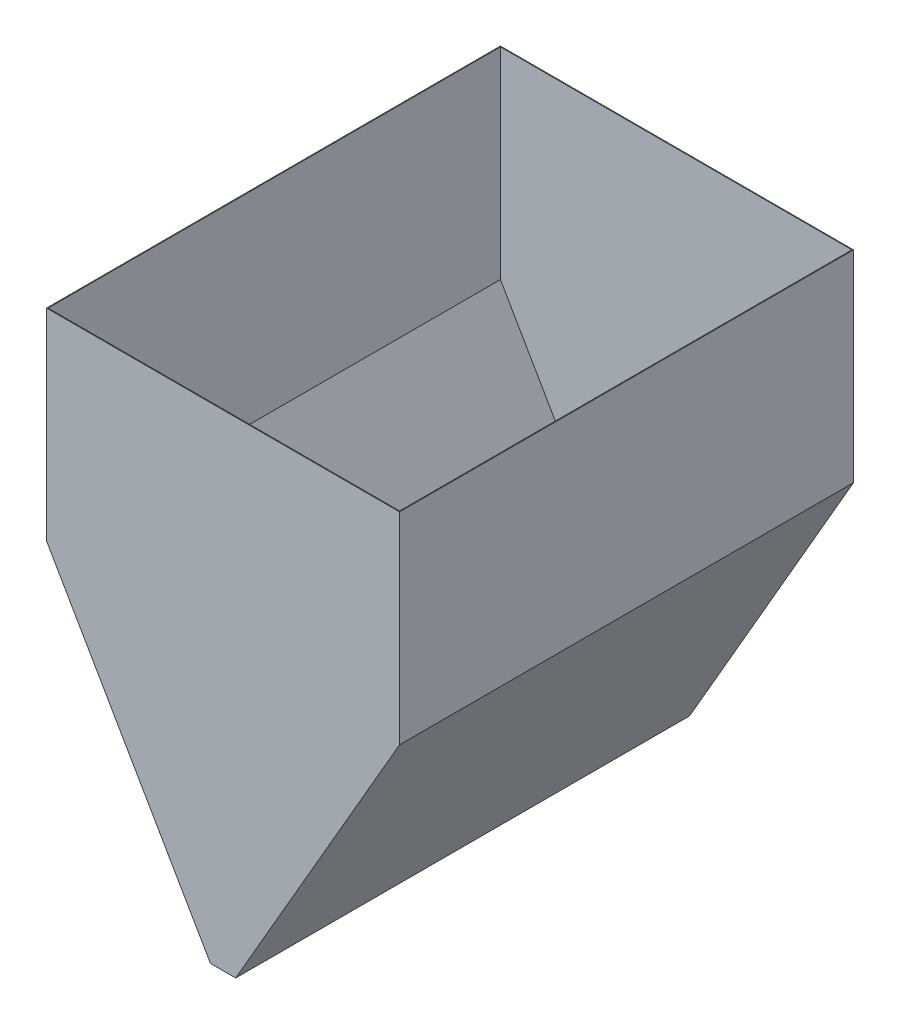
ISO-10303-21;
HEADER;
FILE_DESCRIPTION(('STEP AP214'),'2;1');
FILE_NAME('part.step','',(''),(''),'','','');
FILE_SCHEMA(('AUTOMOTIVE_DESIGN { 1 0 10303 214 1 1 1 1 }'));
ENDSEC;
DATA;
#1=APPLICATION_CONTEXT('core data for automotive mechanical design processes');
#2=APPLICATION_PROTOCOL_DEFINITION('international standard','automotive_design',2000,#1);
#3=PRODUCT_CONTEXT('',#1,'mechanical');
#4=PRODUCT('Part','Part','',(#3));
#5=PRODUCT_RELATED_PRODUCT_CATEGORY('part','',(#4));
#6=PRODUCT_DEFINITION_FORMATION('','',#4);
#7=PRODUCT_DEFINITION_CONTEXT('part definition',#1,'design');
#8=PRODUCT_DEFINITION('design','',#6,#7);
#9=PRODUCT_DEFINITION_SHAPE('','',#8);
#10=(LENGTH_UNIT() NAMED_UNIT(*) SI_UNIT(.MILLI.,.METRE.));
#11=(NAMED_UNIT(*) PLANE_ANGLE_UNIT() SI_UNIT($,.RADIAN.));
#12=(NAMED_UNIT(*) SI_UNIT($,.STERADIAN.) SOLID_ANGLE_UNIT());
#13=UNCERTAINTY_MEASURE_WITH_UNIT(LENGTH_MEASURE(1.E-05),#10,'distance_accuracy_value','');
#14=(GEOMETRIC_REPRESENTATION_CONTEXT(3) GLOBAL_UNCERTAINTY_ASSIGNED_CONTEXT((#13)) GLOBAL_UNIT_ASSIGNED_CONTEXT((#10,
#11,#12)) REPRESENTATION_CONTEXT('',''));
#15=CARTESIAN_POINT('',(0.,0.,0.));
#16=DIRECTION('',(0.,0.,1.));
#17=DIRECTION('',(1.,0.,0.));
#18=AXIS2_PLACEMENT_3D('',#15,#16,#17);
#19=CARTESIAN_POINT('',(0.,-281.458,0.));
#20=DIRECTION('',(0.,1.,0.));
#21=DIRECTION('',(0.,0.,1.));
#22=AXIS2_PLACEMENT_3D('',#19,#20,#21);
#23=PLANE('',#22);
#24=DIRECTION('',(1.,0.,0.));
#25=VECTOR('',#24,1.);
#26=CARTESIAN_POINT('',(0.,-281.458,224.24));
#27=LINE('',#26,#25);
#28=CARTESIAN_POINT('',(-11.6224273911036,-281.458,224.24));
#29=VERTEX_POINT('',#28);
#30=CARTESIAN_POINT('',(11.6224273911036,-281.458,224.24));
#31=VERTEX_POINT('',#30);
#32=EDGE_CURVE('E180',#29,#31,#27,.T.);
#33=ORIENTED_EDGE('',*,*,#32,.T.);
#34=DIRECTION('',(0.,0.,-1.));
#35=VECTOR('',#34,1.);
#36=CARTESIAN_POINT('',(11.6224273911036,-281.458,0.));
#37=LINE('',#36,#35);
#38=CARTESIAN_POINT('',(11.6224273911036,-281.458,-224.24));
#39=VERTEX_POINT('',#38);
#40=EDGE_CURVE('E171',#31,#39,#37,.T.);
#41=ORIENTED_EDGE('',*,*,#40,.T.);
#42=DIRECTION('',(-1.,0.,0.));
#43=VECTOR('',#42,1.);
#44=CARTESIAN_POINT('',(0.,-281.458,-224.24));
#45=LINE('',#44,#43);
#46=CARTESIAN_POINT('',(-11.6224273911037,-281.458,-224.24));
#47=VERTEX_POINT('',#46);
#48=EDGE_CURVE('E140',#39,#47,#45,.T.);
#49=ORIENTED_EDGE('',*,*,#48,.T.);
#50=DIRECTION('',(0.,0.,1.));
#51=VECTOR('',#50,1.);
#52=CARTESIAN_POINT('',(-11.6224273911036,-281.458,0.));
#53=LINE('',#52,#51);
#54=EDGE_CURVE('E63',#47,#29,#53,.T.);
#55=ORIENTED_EDGE('',*,*,#54,.T.);
#56=EDGE_LOOP('',(#33,#41,#49,#55));
#57=FACE_BOUND('',#56,.T.);
#58=DIRECTION('',(0.,0.,-1.));
#59=VECTOR('',#58,1.);
#60=CARTESIAN_POINT('',(12.5,-281.458,-225.));
#61=LINE('',#60,#59);
#62=CARTESIAN_POINT('',(12.5,-281.458,225.));
#63=VERTEX_POINT('',#62);
#64=CARTESIAN_POINT('',(12.5,-281.458,-225.));
#65=VERTEX_POINT('',#64);
#66=EDGE_CURVE('E341',#63,#65,#61,.T.);
#67=ORIENTED_EDGE('',*,*,#66,.F.);
#68=DIRECTION('',(1.,0.,0.));
#69=VECTOR('',#68,1.);
#70=CARTESIAN_POINT('',(-12.5,-281.458,225.));
#71=LINE('',#70,#69);
#72=CARTESIAN_POINT('',(-12.5,-281.458,225.));
#73=VERTEX_POINT('',#72);
#74=EDGE_CURVE('E252',#73,#63,#71,.T.);
#75=ORIENTED_EDGE('',*,*,#74,.F.);
#76=DIRECTION('',(0.,0.,1.));
#77=VECTOR('',#76,1.);
#78=CARTESIAN_POINT('',(-12.5,-281.458,-225.));
#79=LINE('',#78,#77);
#80=CARTESIAN_POINT('',(-12.5,-281.458,-225.));
#81=VERTEX_POINT('',#80);
#82=EDGE_CURVE('E55',#81,#73,#79,.T.);
#83=ORIENTED_EDGE('',*,*,#82,.F.);
#84=DIRECTION('',(-1.,0.,0.));
#85=VECTOR('',#84,1.);
#86=CARTESIAN_POINT('',(-12.5,-281.458,-225.));
#87=LINE('',#86,#85);
#88=EDGE_CURVE('E12',#65,#81,#87,.T.);
#89=ORIENTED_EDGE('',*,*,#88,.F.);
#90=EDGE_LOOP('',(#67,#75,#83,#89));
#91=FACE_BOUND('',#90,.T.);
#92=ADVANCED_FACE('F45',(#57,#91),#23,.F.);
#93=CARTESIAN_POINT('',(0.,0.,-225.));
#94=DIRECTION('',(0.,0.,1.));
#95=DIRECTION('',(0.,-1.,0.));
#96=AXIS2_PLACEMENT_3D('',#93,#94,#95);
#97=PLANE('',#96);
#98=DIRECTION('',(-0.500000341387332,-0.866025206684281,0.));
#99=VECTOR('',#98,1.);
#100=CARTESIAN_POINT('',(175.,0.,-225.));
#101=LINE('',#100,#99);
#102=CARTESIAN_POINT('',(175.,0.,-225.));
#103=VERTEX_POINT('',#102);
#104=EDGE_CURVE('E199',#103,#65,#101,.T.);
#105=ORIENTED_EDGE('',*,*,#104,.T.);
#106=ORIENTED_EDGE('',*,*,#88,.T.);
#107=DIRECTION('',(0.500000341387332,-0.866025206684281,0.));
#108=VECTOR('',#107,1.);
#109=CARTESIAN_POINT('',(-175.,0.,-225.));
#110=LINE('',#109,#108);
#111=CARTESIAN_POINT('',(-175.,0.,-225.));
#112=VERTEX_POINT('',#111);
#113=EDGE_CURVE('E202',#112,#81,#110,.T.);
#114=ORIENTED_EDGE('',*,*,#113,.F.);
#115=DIRECTION('',(0.,-1.,0.));
#116=VECTOR('',#115,1.);
#117=CARTESIAN_POINT('',(-175.,200.,-225.));
#118=LINE('',#117,#116);
#119=CARTESIAN_POINT('',(-175.,200.,-225.));
#120=VERTEX_POINT('',#119);
#121=EDGE_CURVE('E198',#120,#112,#118,.T.);
#122=ORIENTED_EDGE('',*,*,#121,.F.);
#123=DIRECTION('',(-1.,0.,0.));
#124=VECTOR('',#123,1.);
#125=CARTESIAN_POINT('',(-175.,200.,-225.));
#126=LINE('',#125,#124);
#127=CARTESIAN_POINT('',(175.,200.,-225.));
#128=VERTEX_POINT('',#127);
#129=EDGE_CURVE('E196',#128,#120,#126,.T.);
#130=ORIENTED_EDGE('',*,*,#129,.F.);
#131=DIRECTION('',(0.,-1.,0.));
#132=VECTOR('',#131,1.);
#133=CARTESIAN_POINT('',(175.,200.,-225.));
#134=LINE('',#133,#132);
#135=EDGE_CURVE('E287',#128,#103,#134,.T.);
#136=ORIENTED_EDGE('',*,*,#135,.T.);
#137=EDGE_LOOP('',(#105,#106,#114,#122,#130,#136));
#138=FACE_BOUND('',#137,.T.);
#139=ADVANCED_FACE('F315',(#138),#97,.F.);
#140=CARTESIAN_POINT('',(-131.249940257197,-75.7772573236306,0.));
#141=DIRECTION('',(-0.866025206684281,-0.500000341387332,0.));
#142=DIRECTION('',(0.500000341387332,-0.866025206684281,0.));
#143=AXIS2_PLACEMENT_3D('',#140,#141,#142);
#144=PLANE('',#143);
#145=ORIENTED_EDGE('',*,*,#113,.T.);
#146=ORIENTED_EDGE('',*,*,#82,.T.);
#147=DIRECTION('',(0.500000341387332,-0.866025206684281,0.));
#148=VECTOR('',#147,1.);
#149=CARTESIAN_POINT('',(-175.,0.,225.));
#150=LINE('',#149,#148);
#151=CARTESIAN_POINT('',(-175.,0.,225.));
#152=VERTEX_POINT('',#151);
#153=EDGE_CURVE('E340',#152,#73,#150,.T.);
#154=ORIENTED_EDGE('',*,*,#153,.F.);
#155=DIRECTION('',(0.,0.,1.));
#156=VECTOR('',#155,1.);
#157=CARTESIAN_POINT('',(-175.,0.,-225.));
#158=LINE('',#157,#156);
#159=EDGE_CURVE('E203',#112,#152,#158,.T.);
#160=ORIENTED_EDGE('',*,*,#159,.F.);
#161=EDGE_LOOP('',(#145,#146,#154,#160));
#162=FACE_BOUND('',#161,.T.);
#163=ADVANCED_FACE('F231',(#162),#144,.T.);
#164=CARTESIAN_POINT('',(131.249940257197,-75.7772573236306,0.));
#165=DIRECTION('',(0.866025206684281,-0.500000341387332,0.));
#166=DIRECTION('',(0.500000341387332,0.866025206684281,0.));
#167=AXIS2_PLACEMENT_3D('',#164,#165,#166);
#168=PLANE('',#167);
#169=DIRECTION('',(-0.500000341387332,-0.866025206684281,0.));
#170=VECTOR('',#169,1.);
#171=CARTESIAN_POINT('',(175.,0.,225.));
#172=LINE('',#171,#170);
#173=CARTESIAN_POINT('',(175.,0.,225.));
#174=VERTEX_POINT('',#173);
#175=EDGE_CURVE('E207',#174,#63,#172,.T.);
#176=ORIENTED_EDGE('',*,*,#175,.T.);
#177=ORIENTED_EDGE('',*,*,#66,.T.);
#178=ORIENTED_EDGE('',*,*,#104,.F.);
#179=DIRECTION('',(0.,0.,-1.));
#180=VECTOR('',#179,1.);
#181=CARTESIAN_POINT('',(175.,0.,-225.));
#182=LINE('',#181,#180);
#183=EDGE_CURVE('E49',#174,#103,#182,.T.);
#184=ORIENTED_EDGE('',*,*,#183,.F.);
#185=EDGE_LOOP('',(#176,#177,#178,#184));
#186=FACE_BOUND('',#185,.T.);
#187=ADVANCED_FACE('F221',(#186),#168,.T.);
#188=CARTESIAN_POINT('',(0.,0.,225.));
#189=DIRECTION('',(0.,0.,-1.));
#190=DIRECTION('',(0.,1.,0.));
#191=AXIS2_PLACEMENT_3D('',#188,#189,#190);
#192=PLANE('',#191);
#193=ORIENTED_EDGE('',*,*,#153,.T.);
#194=ORIENTED_EDGE('',*,*,#74,.T.);
#195=ORIENTED_EDGE('',*,*,#175,.F.);
#196=DIRECTION('',(0.,-1.,0.));
#197=VECTOR('',#196,1.);
#198=CARTESIAN_POINT('',(175.,200.,225.));
#199=LINE('',#198,#197);
#200=CARTESIAN_POINT('',(175.,200.,225.));
#201=VERTEX_POINT('',#200);
#202=EDGE_CURVE('E292',#201,#174,#199,.T.);
#203=ORIENTED_EDGE('',*,*,#202,.F.);
#204=DIRECTION('',(1.,0.,0.));
#205=VECTOR('',#204,1.);
#206=CARTESIAN_POINT('',(-175.,200.,225.));
#207=LINE('',#206,#205);
#208=CARTESIAN_POINT('',(-175.,200.,225.));
#209=VERTEX_POINT('',#208);
#210=EDGE_CURVE('E192',#209,#201,#207,.T.);
#211=ORIENTED_EDGE('',*,*,#210,.F.);
#212=DIRECTION('',(0.,-1.,0.));
#213=VECTOR('',#212,1.);
#214=CARTESIAN_POINT('',(-175.,200.,225.));
#215=LINE('',#214,#213);
#216=EDGE_CURVE('E364',#209,#152,#215,.T.);
#217=ORIENTED_EDGE('',*,*,#216,.T.);
#218=EDGE_LOOP('',(#193,#194,#195,#203,#211,#217));
#219=FACE_BOUND('',#218,.T.);
#220=ADVANCED_FACE('F230',(#219),#192,.F.);
#221=CARTESIAN_POINT('',(-175.,200.,-225.));
#222=DIRECTION('',(1.,0.,0.));
#223=DIRECTION('',(0.,0.,-1.));
#224=AXIS2_PLACEMENT_3D('',#221,#222,#223);
#225=PLANE('',#224);
#226=ORIENTED_EDGE('',*,*,#159,.T.);
#227=ORIENTED_EDGE('',*,*,#216,.F.);
#228=DIRECTION('',(0.,0.,1.));
#229=VECTOR('',#228,1.);
#230=CARTESIAN_POINT('',(-175.,200.,-225.));
#231=LINE('',#230,#229);
#232=EDGE_CURVE('E178',#120,#209,#231,.T.);
#233=ORIENTED_EDGE('',*,*,#232,.F.);
#234=ORIENTED_EDGE('',*,*,#121,.T.);
#235=EDGE_LOOP('',(#226,#227,#233,#234));
#236=FACE_BOUND('',#235,.T.);
#237=ADVANCED_FACE('F310',(#236),#225,.F.);
#238=CARTESIAN_POINT('',(175.,200.,-225.));
#239=DIRECTION('',(-1.,0.,0.));
#240=DIRECTION('',(0.,0.,1.));
#241=AXIS2_PLACEMENT_3D('',#238,#239,#240);
#242=PLANE('',#241);
#243=ORIENTED_EDGE('',*,*,#183,.T.);
#244=ORIENTED_EDGE('',*,*,#135,.F.);
#245=DIRECTION('',(0.,0.,-1.));
#246=VECTOR('',#245,1.);
#247=CARTESIAN_POINT('',(175.,200.,-225.));
#248=LINE('',#247,#246);
#249=EDGE_CURVE('E194',#201,#128,#248,.T.);
#250=ORIENTED_EDGE('',*,*,#249,.F.);
#251=ORIENTED_EDGE('',*,*,#202,.T.);
#252=EDGE_LOOP('',(#243,#244,#250,#251));
#253=FACE_BOUND('',#252,.T.);
#254=ADVANCED_FACE('F300',(#253),#242,.F.);
#255=CARTESIAN_POINT('',(0.,200.,0.));
#256=DIRECTION('',(0.,1.,0.));
#257=DIRECTION('',(0.,0.,1.));
#258=AXIS2_PLACEMENT_3D('',#255,#256,#257);
#259=PLANE('',#258);
#260=DIRECTION('',(0.,0.,1.));
#261=VECTOR('',#260,1.);
#262=CARTESIAN_POINT('',(-174.24,200.,-225.));
#263=LINE('',#262,#261);
#264=CARTESIAN_POINT('',(-174.24,200.,-224.24));
#265=VERTEX_POINT('',#264);
#266=CARTESIAN_POINT('',(-174.24,200.,224.24));
#267=VERTEX_POINT('',#266);
#268=EDGE_CURVE('E185',#265,#267,#263,.T.);
#269=ORIENTED_EDGE('',*,*,#268,.F.);
#270=DIRECTION('',(-1.,0.,0.));
#271=VECTOR('',#270,1.);
#272=CARTESIAN_POINT('',(0.,200.,-224.24));
#273=LINE('',#272,#271);
#274=CARTESIAN_POINT('',(174.24,200.,-224.24));
#275=VERTEX_POINT('',#274);
#276=EDGE_CURVE('E165',#275,#265,#273,.T.);
#277=ORIENTED_EDGE('',*,*,#276,.F.);
#278=DIRECTION('',(0.,0.,-1.));
#279=VECTOR('',#278,1.);
#280=CARTESIAN_POINT('',(174.24,200.,-225.));
#281=LINE('',#280,#279);
#282=CARTESIAN_POINT('',(174.24,200.,224.24));
#283=VERTEX_POINT('',#282);
#284=EDGE_CURVE('E158',#283,#275,#281,.T.);
#285=ORIENTED_EDGE('',*,*,#284,.F.);
#286=DIRECTION('',(1.,0.,0.));
#287=VECTOR('',#286,1.);
#288=CARTESIAN_POINT('',(0.,200.,224.24));
#289=LINE('',#288,#287);
#290=EDGE_CURVE('E187',#267,#283,#289,.T.);
#291=ORIENTED_EDGE('',*,*,#290,.F.);
#292=EDGE_LOOP('',(#269,#277,#285,#291));
#293=FACE_BOUND('',#292,.T.);
#294=ORIENTED_EDGE('',*,*,#232,.T.);
#295=ORIENTED_EDGE('',*,*,#210,.T.);
#296=ORIENTED_EDGE('',*,*,#249,.T.);
#297=ORIENTED_EDGE('',*,*,#129,.T.);
#298=EDGE_LOOP('',(#294,#295,#296,#297));
#299=FACE_BOUND('',#298,.T.);
#300=ADVANCED_FACE('F309',(#293,#299),#259,.T.);
#301=CARTESIAN_POINT('',(0.,0.,-224.24));
#302=DIRECTION('',(0.,0.,1.));
#303=DIRECTION('',(0.,-1.,0.));
#304=AXIS2_PLACEMENT_3D('',#301,#302,#303);
#305=PLANE('',#304);
#306=DIRECTION('',(-0.500000341387332,-0.866025206684281,0.));
#307=VECTOR('',#306,1.);
#308=CARTESIAN_POINT('',(130.591761100116,-75.3972570641762,-224.24));
#309=LINE('',#308,#307);
#310=CARTESIAN_POINT('',(174.24,0.203641546798489,-224.24));
#311=VERTEX_POINT('',#310);
#312=EDGE_CURVE('E136',#311,#39,#309,.T.);
#313=ORIENTED_EDGE('',*,*,#312,.F.);
#314=DIRECTION('',(0.,-1.,0.));
#315=VECTOR('',#314,1.);
#316=CARTESIAN_POINT('',(174.24,0.,-224.24));
#317=LINE('',#316,#315);
#318=EDGE_CURVE('E71',#275,#311,#317,.T.);
#319=ORIENTED_EDGE('',*,*,#318,.F.);
#320=ORIENTED_EDGE('',*,*,#276,.T.);
#321=DIRECTION('',(0.,-1.,0.));
#322=VECTOR('',#321,1.);
#323=CARTESIAN_POINT('',(-174.24,200.,-224.24));
#324=LINE('',#323,#322);
#325=CARTESIAN_POINT('',(-174.24,0.203641546798531,-224.24));
#326=VERTEX_POINT('',#325);
#327=EDGE_CURVE('E161',#265,#326,#324,.T.);
#328=ORIENTED_EDGE('',*,*,#327,.T.);
#329=DIRECTION('',(0.500000341387332,-0.866025206684281,0.));
#330=VECTOR('',#329,1.);
#331=CARTESIAN_POINT('',(-130.591761100116,-75.3972570641763,-224.24));
#332=LINE('',#331,#330);
#333=EDGE_CURVE('E144',#326,#47,#332,.T.);
#334=ORIENTED_EDGE('',*,*,#333,.T.);
#335=ORIENTED_EDGE('',*,*,#48,.F.);
#336=EDGE_LOOP('',(#313,#319,#320,#328,#334,#335));
#337=FACE_BOUND('',#336,.T.);
#338=ADVANCED_FACE('F138',(#337),#305,.T.);
#339=CARTESIAN_POINT('',(-130.591761100116,-75.3972570641763,0.));
#340=DIRECTION('',(-0.866025206684281,-0.500000341387332,0.));
#341=DIRECTION('',(0.500000341387332,-0.866025206684281,0.));
#342=AXIS2_PLACEMENT_3D('',#339,#340,#341);
#343=PLANE('',#342);
#344=ORIENTED_EDGE('',*,*,#333,.F.);
#345=DIRECTION('',(0.,0.,1.));
#346=VECTOR('',#345,1.);
#347=CARTESIAN_POINT('',(-174.24,0.203641546798528,0.));
#348=LINE('',#347,#346);
#349=CARTESIAN_POINT('',(-174.24,0.20364154679853,224.24));
#350=VERTEX_POINT('',#349);
#351=EDGE_CURVE('E145',#326,#350,#348,.T.);
#352=ORIENTED_EDGE('',*,*,#351,.T.);
#353=DIRECTION('',(0.500000341387332,-0.866025206684281,0.));
#354=VECTOR('',#353,1.);
#355=CARTESIAN_POINT('',(-130.591761100116,-75.3972570641762,224.24));
#356=LINE('',#355,#354);
#357=EDGE_CURVE('E169',#350,#29,#356,.T.);
#358=ORIENTED_EDGE('',*,*,#357,.T.);
#359=ORIENTED_EDGE('',*,*,#54,.F.);
#360=EDGE_LOOP('',(#344,#352,#358,#359));
#361=FACE_BOUND('',#360,.T.);
#362=ADVANCED_FACE('F391',(#361),#343,.F.);
#363=CARTESIAN_POINT('',(130.591761100116,-75.3972570641762,0.));
#364=DIRECTION('',(0.866025206684281,-0.500000341387332,0.));
#365=DIRECTION('',(0.500000341387332,0.866025206684281,0.));
#366=AXIS2_PLACEMENT_3D('',#363,#364,#365);
#367=PLANE('',#366);
#368=DIRECTION('',(-0.500000341387332,-0.866025206684281,0.));
#369=VECTOR('',#368,1.);
#370=CARTESIAN_POINT('',(130.591761100116,-75.3972570641762,224.24));
#371=LINE('',#370,#369);
#372=CARTESIAN_POINT('',(174.24,0.203641546798497,224.24));
#373=VERTEX_POINT('',#372);
#374=EDGE_CURVE('E150',#373,#31,#371,.T.);
#375=ORIENTED_EDGE('',*,*,#374,.F.);
#376=DIRECTION('',(0.,0.,-1.));
#377=VECTOR('',#376,1.);
#378=CARTESIAN_POINT('',(174.24,0.203641546798486,0.));
#379=LINE('',#378,#377);
#380=EDGE_CURVE('E148',#373,#311,#379,.T.);
#381=ORIENTED_EDGE('',*,*,#380,.T.);
#382=ORIENTED_EDGE('',*,*,#312,.T.);
#383=ORIENTED_EDGE('',*,*,#40,.F.);
#384=EDGE_LOOP('',(#375,#381,#382,#383));
#385=FACE_BOUND('',#384,.T.);
#386=ADVANCED_FACE('F149',(#385),#367,.F.);
#387=CARTESIAN_POINT('',(0.,0.,224.24));
#388=DIRECTION('',(0.,0.,-1.));
#389=DIRECTION('',(0.,1.,0.));
#390=AXIS2_PLACEMENT_3D('',#387,#388,#389);
#391=PLANE('',#390);
#392=ORIENTED_EDGE('',*,*,#357,.F.);
#393=DIRECTION('',(0.,-1.,0.));
#394=VECTOR('',#393,1.);
#395=CARTESIAN_POINT('',(-174.24,0.,224.24));
#396=LINE('',#395,#394);
#397=EDGE_CURVE('E154',#267,#350,#396,.T.);
#398=ORIENTED_EDGE('',*,*,#397,.F.);
#399=ORIENTED_EDGE('',*,*,#290,.T.);
#400=DIRECTION('',(0.,-1.,0.));
#401=VECTOR('',#400,1.);
#402=CARTESIAN_POINT('',(174.24,200.,224.24));
#403=LINE('',#402,#401);
#404=EDGE_CURVE('E160',#283,#373,#403,.T.);
#405=ORIENTED_EDGE('',*,*,#404,.T.);
#406=ORIENTED_EDGE('',*,*,#374,.T.);
#407=ORIENTED_EDGE('',*,*,#32,.F.);
#408=EDGE_LOOP('',(#392,#398,#399,#405,#406,#407));
#409=FACE_BOUND('',#408,.T.);
#410=ADVANCED_FACE('F382',(#409),#391,.T.);
#411=CARTESIAN_POINT('',(-174.24,200.,-225.));
#412=DIRECTION('',(1.,0.,0.));
#413=DIRECTION('',(0.,0.,-1.));
#414=AXIS2_PLACEMENT_3D('',#411,#412,#413);
#415=PLANE('',#414);
#416=ORIENTED_EDGE('',*,*,#351,.F.);
#417=ORIENTED_EDGE('',*,*,#327,.F.);
#418=ORIENTED_EDGE('',*,*,#268,.T.);
#419=ORIENTED_EDGE('',*,*,#397,.T.);
#420=EDGE_LOOP('',(#416,#417,#418,#419));
#421=FACE_BOUND('',#420,.T.);
#422=ADVANCED_FACE('F390',(#421),#415,.T.);
#423=CARTESIAN_POINT('',(174.24,200.,-225.));
#424=DIRECTION('',(-1.,0.,0.));
#425=DIRECTION('',(0.,0.,1.));
#426=AXIS2_PLACEMENT_3D('',#423,#424,#425);
#427=PLANE('',#426);
#428=ORIENTED_EDGE('',*,*,#380,.F.);
#429=ORIENTED_EDGE('',*,*,#404,.F.);
#430=ORIENTED_EDGE('',*,*,#284,.T.);
#431=ORIENTED_EDGE('',*,*,#318,.T.);
#432=EDGE_LOOP('',(#428,#429,#430,#431));
#433=FACE_BOUND('',#432,.T.);
#434=ADVANCED_FACE('F156',(#433),#427,.T.);
#435=CLOSED_SHELL('',(#92,#139,#163,#187,#220,#237,#254,#300,#338,#362,#386,#410,#422,#434));
#436=MANIFOLD_SOLID_BREP('B2',#435);
#437=ADVANCED_BREP_SHAPE_REPRESENTATION('',(#18,#436),#14);
#438=SHAPE_DEFINITION_REPRESENTATION(#9,#437);
ENDSEC;
END-ISO-10303-21;
